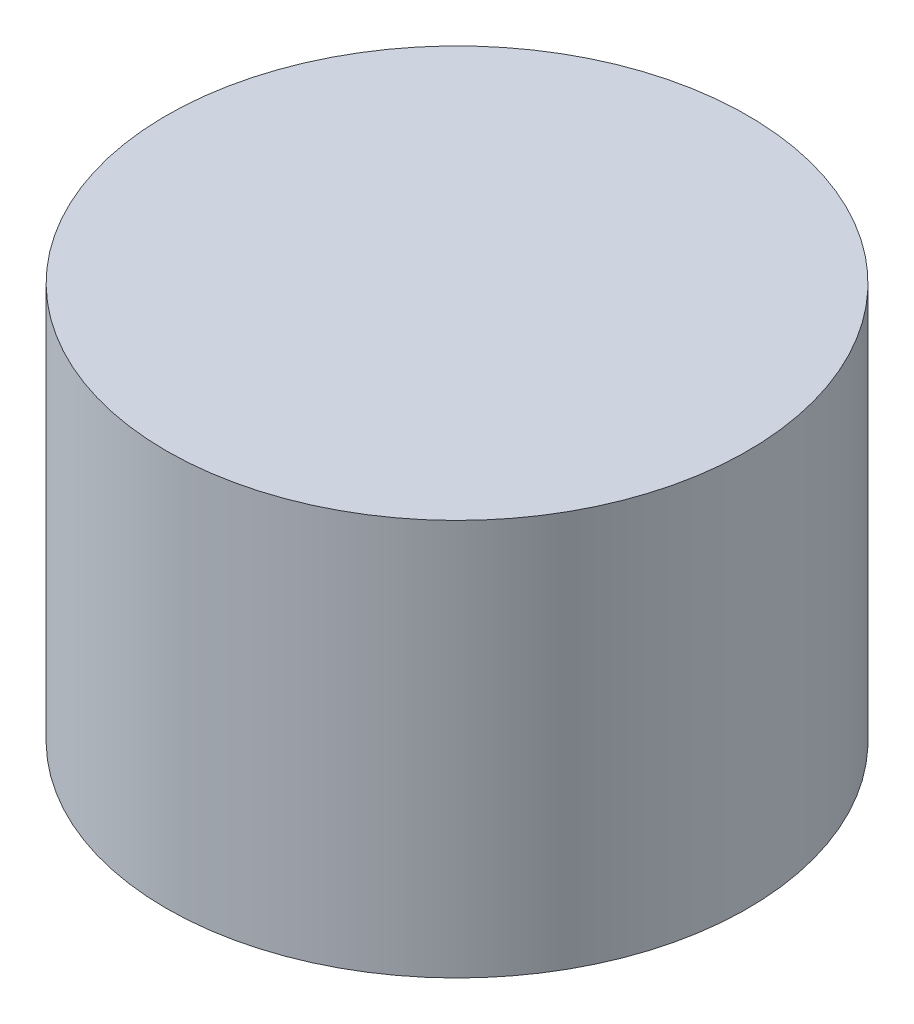
ISO-10303-21;
HEADER;
FILE_DESCRIPTION(('STEP AP214'),'2;1');
FILE_NAME('part.step','',(''),(''),'','','');
FILE_SCHEMA(('AUTOMOTIVE_DESIGN { 1 0 10303 214 1 1 1 1 }'));
ENDSEC;
DATA;
#1=APPLICATION_CONTEXT('core data for automotive mechanical design processes');
#2=APPLICATION_PROTOCOL_DEFINITION('international standard','automotive_design',2000,#1);
#3=PRODUCT_CONTEXT('',#1,'mechanical');
#4=PRODUCT('Part','Part','',(#3));
#5=PRODUCT_RELATED_PRODUCT_CATEGORY('part','',(#4));
#6=PRODUCT_DEFINITION_FORMATION('','',#4);
#7=PRODUCT_DEFINITION_CONTEXT('part definition',#1,'design');
#8=PRODUCT_DEFINITION('design','',#6,#7);
#9=PRODUCT_DEFINITION_SHAPE('','',#8);
#10=(LENGTH_UNIT() NAMED_UNIT(*) SI_UNIT(.MILLI.,.METRE.));
#11=(NAMED_UNIT(*) PLANE_ANGLE_UNIT() SI_UNIT($,.RADIAN.));
#12=(NAMED_UNIT(*) SI_UNIT($,.STERADIAN.) SOLID_ANGLE_UNIT());
#13=UNCERTAINTY_MEASURE_WITH_UNIT(LENGTH_MEASURE(1.E-05),#10,'distance_accuracy_value','');
#14=(GEOMETRIC_REPRESENTATION_CONTEXT(3) GLOBAL_UNCERTAINTY_ASSIGNED_CONTEXT((#13)) GLOBAL_UNIT_ASSIGNED_CONTEXT((#10,
#11,#12)) REPRESENTATION_CONTEXT('',''));
#15=CARTESIAN_POINT('',(0.,0.,0.));
#16=DIRECTION('',(0.,0.,1.));
#17=DIRECTION('',(1.,0.,0.));
#18=AXIS2_PLACEMENT_3D('',#15,#16,#17);
#19=CARTESIAN_POINT('',(0.,30.,0.));
#20=DIRECTION('',(0.,-1.,0.));
#21=DIRECTION('',(0.,0.,-1.));
#22=AXIS2_PLACEMENT_3D('',#19,#20,#21);
#23=CYLINDRICAL_SURFACE('',#22,22.);
#24=CARTESIAN_POINT('',(0.,30.,0.));
#25=DIRECTION('',(0.,1.,0.));
#26=DIRECTION('',(0.,0.,1.));
#27=AXIS2_PLACEMENT_3D('',#24,#25,#26);
#28=CIRCLE('',#27,22.);
#29=CARTESIAN_POINT('',(0.,30.,22.));
#30=VERTEX_POINT('',#29);
#31=EDGE_CURVE('E10',#30,#30,#28,.T.);
#32=ORIENTED_EDGE('',*,*,#31,.F.);
#33=EDGE_LOOP('',(#32));
#34=FACE_BOUND('',#33,.T.);
#35=CARTESIAN_POINT('',(0.,0.,0.));
#36=DIRECTION('',(0.,1.,0.));
#37=DIRECTION('',(0.,0.,1.));
#38=AXIS2_PLACEMENT_3D('',#35,#36,#37);
#39=CIRCLE('',#38,22.);
#40=CARTESIAN_POINT('',(0.,0.,22.));
#41=VERTEX_POINT('',#40);
#42=EDGE_CURVE('E42',#41,#41,#39,.T.);
#43=ORIENTED_EDGE('',*,*,#42,.T.);
#44=EDGE_LOOP('',(#43));
#45=FACE_BOUND('',#44,.T.);
#46=ADVANCED_FACE('F41',(#34,#45),#23,.T.);
#47=CARTESIAN_POINT('',(0.,30.,0.));
#48=DIRECTION('',(0.,1.,0.));
#49=DIRECTION('',(0.,0.,1.));
#50=AXIS2_PLACEMENT_3D('',#47,#48,#49);
#51=PLANE('',#50);
#52=ORIENTED_EDGE('',*,*,#31,.T.);
#53=EDGE_LOOP('',(#52));
#54=FACE_BOUND('',#53,.T.);
#55=ADVANCED_FACE('F57',(#54),#51,.T.);
#56=CARTESIAN_POINT('',(0.,0.,0.));
#57=DIRECTION('',(0.,1.,0.));
#58=DIRECTION('',(0.,0.,1.));
#59=AXIS2_PLACEMENT_3D('',#56,#57,#58);
#60=PLANE('',#59);
#61=ORIENTED_EDGE('',*,*,#42,.F.);
#62=EDGE_LOOP('',(#61));
#63=FACE_BOUND('',#62,.T.);
#64=ADVANCED_FACE('F53',(#63),#60,.F.);
#65=CLOSED_SHELL('',(#46,#55,#64));
#66=MANIFOLD_SOLID_BREP('B2',#65);
#67=ADVANCED_BREP_SHAPE_REPRESENTATION('',(#18,#66),#14);
#68=SHAPE_DEFINITION_REPRESENTATION(#9,#67);
ENDSEC;
END-ISO-10303-21;
